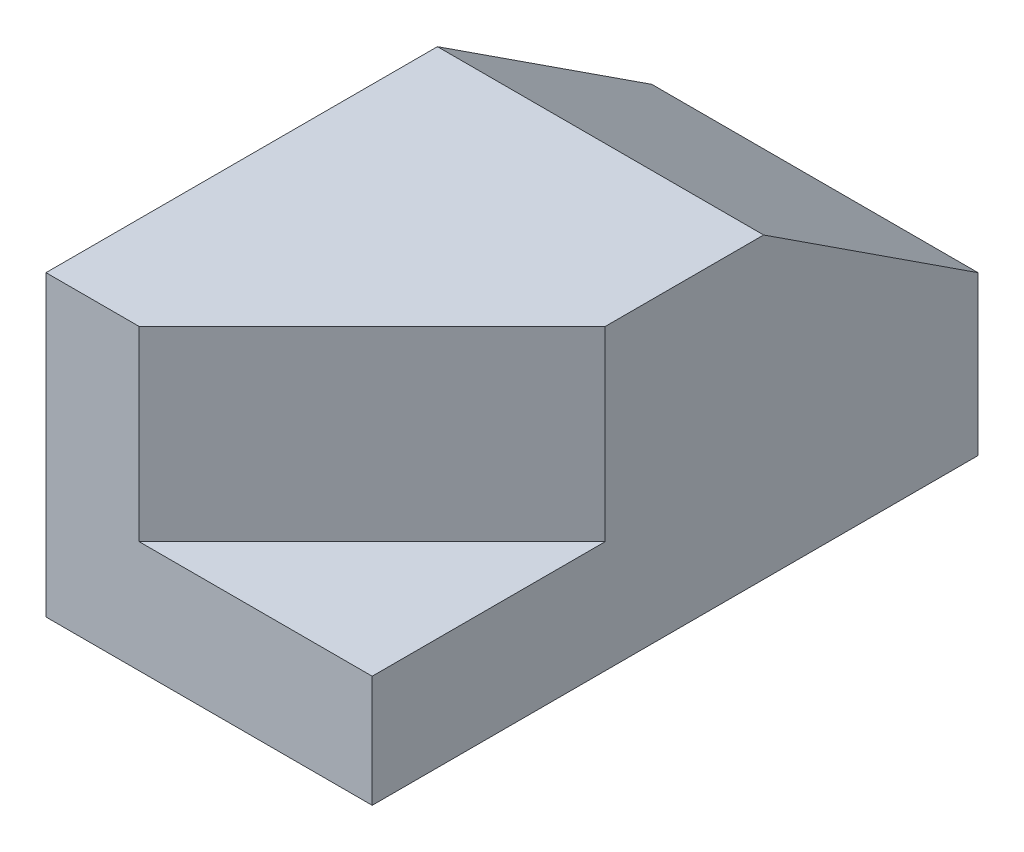
ISO-10303-21;
HEADER;
FILE_DESCRIPTION(('STEP AP214'),'2;1');
FILE_NAME('part.step','',(''),(''),'','','');
FILE_SCHEMA(('AUTOMOTIVE_DESIGN { 1 0 10303 214 1 1 1 1 }'));
ENDSEC;
DATA;
#1=APPLICATION_CONTEXT('core data for automotive mechanical design processes');
#2=APPLICATION_PROTOCOL_DEFINITION('international standard','automotive_design',2000,#1);
#3=PRODUCT_CONTEXT('',#1,'mechanical');
#4=PRODUCT('Part','Part','',(#3));
#5=PRODUCT_RELATED_PRODUCT_CATEGORY('part','',(#4));
#6=PRODUCT_DEFINITION_FORMATION('','',#4);
#7=PRODUCT_DEFINITION_CONTEXT('part definition',#1,'design');
#8=PRODUCT_DEFINITION('design','',#6,#7);
#9=PRODUCT_DEFINITION_SHAPE('','',#8);
#10=(LENGTH_UNIT() NAMED_UNIT(*) SI_UNIT(.MILLI.,.METRE.));
#11=(NAMED_UNIT(*) PLANE_ANGLE_UNIT() SI_UNIT($,.RADIAN.));
#12=(NAMED_UNIT(*) SI_UNIT($,.STERADIAN.) SOLID_ANGLE_UNIT());
#13=UNCERTAINTY_MEASURE_WITH_UNIT(LENGTH_MEASURE(1.E-05),#10,'distance_accuracy_value','');
#14=(GEOMETRIC_REPRESENTATION_CONTEXT(3) GLOBAL_UNCERTAINTY_ASSIGNED_CONTEXT((#13)) GLOBAL_UNIT_ASSIGNED_CONTEXT((#10,
#11,#12)) REPRESENTATION_CONTEXT('',''));
#15=CARTESIAN_POINT('',(0.,0.,0.));
#16=DIRECTION('',(0.,0.,1.));
#17=DIRECTION('',(1.,0.,0.));
#18=AXIS2_PLACEMENT_3D('',#15,#16,#17);
#19=CARTESIAN_POINT('',(35.,0.,0.));
#20=DIRECTION('',(1.,0.,0.));
#21=DIRECTION('',(0.,0.,-1.));
#22=AXIS2_PLACEMENT_3D('',#19,#20,#21);
#23=PLANE('',#22);
#24=DIRECTION('',(0.,0.,-1.));
#25=VECTOR('',#24,1.);
#26=CARTESIAN_POINT('',(35.,16.,0.));
#27=LINE('',#26,#25);
#28=CARTESIAN_POINT('',(35.,16.,7.5));
#29=VERTEX_POINT('',#28);
#30=CARTESIAN_POINT('',(35.,16.,-9.5));
#31=VERTEX_POINT('',#30);
#32=EDGE_CURVE('E105',#29,#31,#27,.T.);
#33=ORIENTED_EDGE('',*,*,#32,.F.);
#34=DIRECTION('',(0.,-1.,0.));
#35=VECTOR('',#34,1.);
#36=CARTESIAN_POINT('',(35.,156.576463449457,7.5));
#37=LINE('',#36,#35);
#38=CARTESIAN_POINT('',(35.,-4.,7.5));
#39=VERTEX_POINT('',#38);
#40=EDGE_CURVE('E100',#29,#39,#37,.T.);
#41=ORIENTED_EDGE('',*,*,#40,.T.);
#42=DIRECTION('',(0.,0.,-1.));
#43=VECTOR('',#42,1.);
#44=CARTESIAN_POINT('',(35.,-4.,0.));
#45=LINE('',#44,#43);
#46=CARTESIAN_POINT('',(35.,-4.,32.5));
#47=VERTEX_POINT('',#46);
#48=EDGE_CURVE('E103',#47,#39,#45,.T.);
#49=ORIENTED_EDGE('',*,*,#48,.F.);
#50=DIRECTION('',(0.,1.,0.));
#51=VECTOR('',#50,1.);
#52=CARTESIAN_POINT('',(35.,0.,32.5));
#53=LINE('',#52,#51);
#54=CARTESIAN_POINT('',(35.,-16.,32.5));
#55=VERTEX_POINT('',#54);
#56=EDGE_CURVE('E132',#55,#47,#53,.T.);
#57=ORIENTED_EDGE('',*,*,#56,.F.);
#58=DIRECTION('',(0.,0.,-1.));
#59=VECTOR('',#58,1.);
#60=CARTESIAN_POINT('',(35.,-16.,0.));
#61=LINE('',#60,#59);
#62=CARTESIAN_POINT('',(35.,-16.,-32.5));
#63=VERTEX_POINT('',#62);
#64=EDGE_CURVE('E122',#55,#63,#61,.T.);
#65=ORIENTED_EDGE('',*,*,#64,.T.);
#66=DIRECTION('',(0.,1.,0.));
#67=VECTOR('',#66,1.);
#68=CARTESIAN_POINT('',(35.,0.,-32.5));
#69=LINE('',#68,#67);
#70=CARTESIAN_POINT('',(35.,0.999999999999999,-32.5));
#71=VERTEX_POINT('',#70);
#72=EDGE_CURVE('E125',#63,#71,#69,.T.);
#73=ORIENTED_EDGE('',*,*,#72,.T.);
#74=DIRECTION('',(0.,-0.546267780546922,-0.837610596838614));
#75=VECTOR('',#74,1.);
#76=CARTESIAN_POINT('',(35.,15.5722811671088,-10.1558355437666));
#77=LINE('',#76,#75);
#78=EDGE_CURVE('E128',#31,#71,#77,.T.);
#79=ORIENTED_EDGE('',*,*,#78,.F.);
#80=EDGE_LOOP('',(#33,#41,#49,#57,#65,#73,#79));
#81=FACE_BOUND('',#80,.T.);
#82=ADVANCED_FACE('F41',(#81),#23,.T.);
#83=CARTESIAN_POINT('',(35.,-16.,0.));
#84=DIRECTION('',(0.,1.,0.));
#85=DIRECTION('',(0.,0.,1.));
#86=AXIS2_PLACEMENT_3D('',#83,#84,#85);
#87=PLANE('',#86);
#88=DIRECTION('',(0.,0.,-1.));
#89=VECTOR('',#88,1.);
#90=CARTESIAN_POINT('',(0.,-16.,0.));
#91=LINE('',#90,#89);
#92=CARTESIAN_POINT('',(0.,-16.,32.5));
#93=VERTEX_POINT('',#92);
#94=CARTESIAN_POINT('',(0.,-16.,-32.5));
#95=VERTEX_POINT('',#94);
#96=EDGE_CURVE('E120',#93,#95,#91,.T.);
#97=ORIENTED_EDGE('',*,*,#96,.T.);
#98=DIRECTION('',(-1.,0.,0.));
#99=VECTOR('',#98,1.);
#100=CARTESIAN_POINT('',(35.,-16.,-32.5));
#101=LINE('',#100,#99);
#102=EDGE_CURVE('E11',#63,#95,#101,.T.);
#103=ORIENTED_EDGE('',*,*,#102,.F.);
#104=ORIENTED_EDGE('',*,*,#64,.F.);
#105=DIRECTION('',(-1.,0.,0.));
#106=VECTOR('',#105,1.);
#107=CARTESIAN_POINT('',(35.,-16.,32.5));
#108=LINE('',#107,#106);
#109=EDGE_CURVE('E134',#55,#93,#108,.T.);
#110=ORIENTED_EDGE('',*,*,#109,.T.);
#111=EDGE_LOOP('',(#97,#103,#104,#110));
#112=FACE_BOUND('',#111,.T.);
#113=ADVANCED_FACE('F43',(#112),#87,.F.);
#114=CARTESIAN_POINT('',(35.,0.,-32.5));
#115=DIRECTION('',(0.,0.,1.));
#116=DIRECTION('',(1.,0.,0.));
#117=AXIS2_PLACEMENT_3D('',#114,#115,#116);
#118=PLANE('',#117);
#119=DIRECTION('',(0.,1.,0.));
#120=VECTOR('',#119,1.);
#121=CARTESIAN_POINT('',(0.,0.,-32.5));
#122=LINE('',#121,#120);
#123=CARTESIAN_POINT('',(0.,0.999999999999999,-32.5));
#124=VERTEX_POINT('',#123);
#125=EDGE_CURVE('E137',#95,#124,#122,.T.);
#126=ORIENTED_EDGE('',*,*,#125,.T.);
#127=DIRECTION('',(-1.,0.,0.));
#128=VECTOR('',#127,1.);
#129=CARTESIAN_POINT('',(35.,0.999999999999999,-32.5));
#130=LINE('',#129,#128);
#131=EDGE_CURVE('E49',#71,#124,#130,.T.);
#132=ORIENTED_EDGE('',*,*,#131,.F.);
#133=ORIENTED_EDGE('',*,*,#72,.F.);
#134=ORIENTED_EDGE('',*,*,#102,.T.);
#135=EDGE_LOOP('',(#126,#132,#133,#134));
#136=FACE_BOUND('',#135,.T.);
#137=ADVANCED_FACE('F158',(#136),#118,.F.);
#138=CARTESIAN_POINT('',(35.,15.5722811671088,-10.1558355437666));
#139=DIRECTION('',(0.,0.837610596838614,-0.546267780546922));
#140=DIRECTION('',(0.,0.546267780546922,0.837610596838614));
#141=AXIS2_PLACEMENT_3D('',#138,#139,#140);
#142=PLANE('',#141);
#143=DIRECTION('',(0.,-0.546267780546922,-0.837610596838614));
#144=VECTOR('',#143,1.);
#145=CARTESIAN_POINT('',(0.,15.5722811671088,-10.1558355437666));
#146=LINE('',#145,#144);
#147=CARTESIAN_POINT('',(0.,16.,-9.5));
#148=VERTEX_POINT('',#147);
#149=EDGE_CURVE('E140',#148,#124,#146,.T.);
#150=ORIENTED_EDGE('',*,*,#149,.F.);
#151=DIRECTION('',(-1.,0.,0.));
#152=VECTOR('',#151,1.);
#153=CARTESIAN_POINT('',(35.,16.,-9.5));
#154=LINE('',#153,#152);
#155=EDGE_CURVE('E151',#31,#148,#154,.T.);
#156=ORIENTED_EDGE('',*,*,#155,.F.);
#157=ORIENTED_EDGE('',*,*,#78,.T.);
#158=ORIENTED_EDGE('',*,*,#131,.T.);
#159=EDGE_LOOP('',(#150,#156,#157,#158));
#160=FACE_BOUND('',#159,.T.);
#161=ADVANCED_FACE('F155',(#160),#142,.T.);
#162=CARTESIAN_POINT('',(35.,16.,0.));
#163=DIRECTION('',(0.,1.,0.));
#164=DIRECTION('',(0.,0.,1.));
#165=AXIS2_PLACEMENT_3D('',#162,#163,#164);
#166=PLANE('',#165);
#167=DIRECTION('',(-0.707106781186548,0.,0.707106781186548));
#168=VECTOR('',#167,1.);
#169=CARTESIAN_POINT('',(35.,16.,7.5));
#170=LINE('',#169,#168);
#171=CARTESIAN_POINT('',(10.,16.,32.5));
#172=VERTEX_POINT('',#171);
#173=EDGE_CURVE('E109',#29,#172,#170,.T.);
#174=ORIENTED_EDGE('',*,*,#173,.F.);
#175=ORIENTED_EDGE('',*,*,#32,.T.);
#176=ORIENTED_EDGE('',*,*,#155,.T.);
#177=DIRECTION('',(0.,0.,-1.));
#178=VECTOR('',#177,1.);
#179=CARTESIAN_POINT('',(0.,16.,0.));
#180=LINE('',#179,#178);
#181=CARTESIAN_POINT('',(0.,16.,32.5));
#182=VERTEX_POINT('',#181);
#183=EDGE_CURVE('E143',#182,#148,#180,.T.);
#184=ORIENTED_EDGE('',*,*,#183,.F.);
#185=DIRECTION('',(-1.,0.,0.));
#186=VECTOR('',#185,1.);
#187=CARTESIAN_POINT('',(35.,16.,32.5));
#188=LINE('',#187,#186);
#189=EDGE_CURVE('E149',#172,#182,#188,.T.);
#190=ORIENTED_EDGE('',*,*,#189,.F.);
#191=EDGE_LOOP('',(#174,#175,#176,#184,#190));
#192=FACE_BOUND('',#191,.T.);
#193=ADVANCED_FACE('F166',(#192),#166,.T.);
#194=CARTESIAN_POINT('',(35.,0.,32.5));
#195=DIRECTION('',(0.,0.,1.));
#196=DIRECTION('',(1.,0.,0.));
#197=AXIS2_PLACEMENT_3D('',#194,#195,#196);
#198=PLANE('',#197);
#199=DIRECTION('',(0.,-1.,0.));
#200=VECTOR('',#199,1.);
#201=CARTESIAN_POINT('',(10.,156.576463449457,32.5));
#202=LINE('',#201,#200);
#203=CARTESIAN_POINT('',(10.,-4.,32.5));
#204=VERTEX_POINT('',#203);
#205=EDGE_CURVE('E61',#172,#204,#202,.T.);
#206=ORIENTED_EDGE('',*,*,#205,.F.);
#207=ORIENTED_EDGE('',*,*,#189,.T.);
#208=DIRECTION('',(0.,1.,0.));
#209=VECTOR('',#208,1.);
#210=CARTESIAN_POINT('',(0.,0.,32.5));
#211=LINE('',#210,#209);
#212=EDGE_CURVE('E126',#93,#182,#211,.T.);
#213=ORIENTED_EDGE('',*,*,#212,.F.);
#214=ORIENTED_EDGE('',*,*,#109,.F.);
#215=ORIENTED_EDGE('',*,*,#56,.T.);
#216=DIRECTION('',(-1.,0.,0.));
#217=VECTOR('',#216,1.);
#218=CARTESIAN_POINT('',(35.,-4.,32.5));
#219=LINE('',#218,#217);
#220=EDGE_CURVE('E56',#47,#204,#219,.T.);
#221=ORIENTED_EDGE('',*,*,#220,.T.);
#222=EDGE_LOOP('',(#206,#207,#213,#214,#215,#221));
#223=FACE_BOUND('',#222,.T.);
#224=ADVANCED_FACE('F169',(#223),#198,.T.);
#225=CARTESIAN_POINT('',(0.,0.,0.));
#226=DIRECTION('',(1.,0.,0.));
#227=DIRECTION('',(0.,0.,-1.));
#228=AXIS2_PLACEMENT_3D('',#225,#226,#227);
#229=PLANE('',#228);
#230=ORIENTED_EDGE('',*,*,#96,.F.);
#231=ORIENTED_EDGE('',*,*,#212,.T.);
#232=ORIENTED_EDGE('',*,*,#183,.T.);
#233=ORIENTED_EDGE('',*,*,#149,.T.);
#234=ORIENTED_EDGE('',*,*,#125,.F.);
#235=EDGE_LOOP('',(#230,#231,#232,#233,#234));
#236=FACE_BOUND('',#235,.T.);
#237=ADVANCED_FACE('F162',(#236),#229,.F.);
#238=CARTESIAN_POINT('',(35.,156.576463449457,7.5));
#239=DIRECTION('',(0.707106781186547,0.,0.707106781186547));
#240=DIRECTION('',(0.707106781186548,0.,-0.707106781186548));
#241=AXIS2_PLACEMENT_3D('',#238,#239,#240);
#242=PLANE('',#241);
#243=ORIENTED_EDGE('',*,*,#40,.F.);
#244=ORIENTED_EDGE('',*,*,#173,.T.);
#245=ORIENTED_EDGE('',*,*,#205,.T.);
#246=DIRECTION('',(-0.707106781186548,0.,0.707106781186548));
#247=VECTOR('',#246,1.);
#248=CARTESIAN_POINT('',(35.,-4.,7.5));
#249=LINE('',#248,#247);
#250=EDGE_CURVE('E113',#39,#204,#249,.T.);
#251=ORIENTED_EDGE('',*,*,#250,.F.);
#252=EDGE_LOOP('',(#243,#244,#245,#251));
#253=FACE_BOUND('',#252,.T.);
#254=ADVANCED_FACE('F115',(#253),#242,.T.);
#255=CARTESIAN_POINT('',(35.,-4.,0.));
#256=DIRECTION('',(0.,1.,0.));
#257=DIRECTION('',(0.,0.,1.));
#258=AXIS2_PLACEMENT_3D('',#255,#256,#257);
#259=PLANE('',#258);
#260=ORIENTED_EDGE('',*,*,#250,.T.);
#261=ORIENTED_EDGE('',*,*,#220,.F.);
#262=ORIENTED_EDGE('',*,*,#48,.T.);
#263=EDGE_LOOP('',(#260,#261,#262));
#264=FACE_BOUND('',#263,.T.);
#265=ADVANCED_FACE('F112',(#264),#259,.T.);
#266=CLOSED_SHELL('',(#82,#113,#137,#161,#193,#224,#237,#254,#265));
#267=MANIFOLD_SOLID_BREP('B2',#266);
#268=ADVANCED_BREP_SHAPE_REPRESENTATION('',(#18,#267),#14);
#269=SHAPE_DEFINITION_REPRESENTATION(#9,#268);
ENDSEC;
END-ISO-10303-21;
